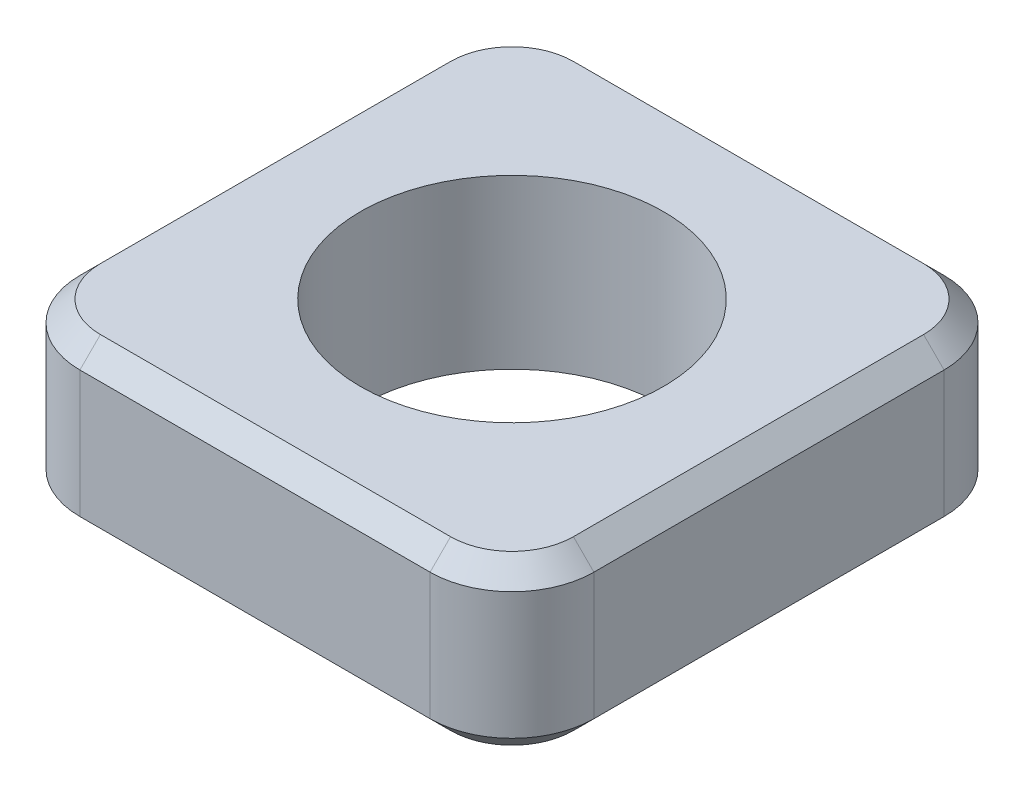
ISO-10303-21;
HEADER;
FILE_DESCRIPTION(('STEP AP214'),'2;1');
FILE_NAME('part.step','',(''),(''),'','','');
FILE_SCHEMA(('AUTOMOTIVE_DESIGN { 1 0 10303 214 1 1 1 1 }'));
ENDSEC;
DATA;
#1=APPLICATION_CONTEXT('core data for automotive mechanical design processes');
#2=APPLICATION_PROTOCOL_DEFINITION('international standard','automotive_design',2000,#1);
#3=PRODUCT_CONTEXT('',#1,'mechanical');
#4=PRODUCT('Part','Part','',(#3));
#5=PRODUCT_RELATED_PRODUCT_CATEGORY('part','',(#4));
#6=PRODUCT_DEFINITION_FORMATION('','',#4);
#7=PRODUCT_DEFINITION_CONTEXT('part definition',#1,'design');
#8=PRODUCT_DEFINITION('design','',#6,#7);
#9=PRODUCT_DEFINITION_SHAPE('','',#8);
#10=(LENGTH_UNIT() NAMED_UNIT(*) SI_UNIT(.MILLI.,.METRE.));
#11=(NAMED_UNIT(*) PLANE_ANGLE_UNIT() SI_UNIT($,.RADIAN.));
#12=(NAMED_UNIT(*) SI_UNIT($,.STERADIAN.) SOLID_ANGLE_UNIT());
#13=UNCERTAINTY_MEASURE_WITH_UNIT(LENGTH_MEASURE(1.E-05),#10,'distance_accuracy_value','');
#14=(GEOMETRIC_REPRESENTATION_CONTEXT(3) GLOBAL_UNCERTAINTY_ASSIGNED_CONTEXT((#13)) GLOBAL_UNIT_ASSIGNED_CONTEXT((#10,
#11,#12)) REPRESENTATION_CONTEXT('',''));
#15=CARTESIAN_POINT('',(0.,0.,0.));
#16=DIRECTION('',(0.,0.,1.));
#17=DIRECTION('',(1.,0.,0.));
#18=AXIS2_PLACEMENT_3D('',#15,#16,#17);
#19=CARTESIAN_POINT('',(2.1375,2.05,2.1375));
#20=DIRECTION('',(0.,1.,0.));
#21=DIRECTION('',(0.,0.,1.));
#22=AXIS2_PLACEMENT_3D('',#19,#20,#21);
#23=PLANE('',#22);
#24=CARTESIAN_POINT('',(2.1375,2.05,2.1375));
#25=DIRECTION('',(0.,1.,0.));
#26=DIRECTION('',(0.,0.,1.));
#27=AXIS2_PLACEMENT_3D('',#24,#25,#26);
#28=CIRCLE('',#27,0.749999999999999);
#29=CARTESIAN_POINT('',(2.1375,2.05,2.8875));
#30=VERTEX_POINT('',#29);
#31=CARTESIAN_POINT('',(2.8875,2.05,2.1375));
#32=VERTEX_POINT('',#31);
#33=EDGE_CURVE('E57',#30,#32,#28,.T.);
#34=ORIENTED_EDGE('',*,*,#33,.T.);
#35=DIRECTION('',(0.,0.,-1.));
#36=VECTOR('',#35,1.);
#37=CARTESIAN_POINT('',(2.8875,2.05,-2.1375));
#38=LINE('',#37,#36);
#39=CARTESIAN_POINT('',(2.8875,2.05,-2.1375));
#40=VERTEX_POINT('',#39);
#41=EDGE_CURVE('E11',#32,#40,#38,.T.);
#42=ORIENTED_EDGE('',*,*,#41,.T.);
#43=CARTESIAN_POINT('',(2.1375,2.05,-2.1375));
#44=DIRECTION('',(0.,1.,0.));
#45=DIRECTION('',(0.,0.,1.));
#46=AXIS2_PLACEMENT_3D('',#43,#44,#45);
#47=CIRCLE('',#46,0.75);
#48=CARTESIAN_POINT('',(2.1375,2.05,-2.8875));
#49=VERTEX_POINT('',#48);
#50=EDGE_CURVE('E42',#40,#49,#47,.T.);
#51=ORIENTED_EDGE('',*,*,#50,.T.);
#52=DIRECTION('',(-1.,0.,0.));
#53=VECTOR('',#52,1.);
#54=CARTESIAN_POINT('',(-2.1375,2.05,-2.8875));
#55=LINE('',#54,#53);
#56=CARTESIAN_POINT('',(-2.1375,2.05,-2.8875));
#57=VERTEX_POINT('',#56);
#58=EDGE_CURVE('E247',#49,#57,#55,.T.);
#59=ORIENTED_EDGE('',*,*,#58,.T.);
#60=CARTESIAN_POINT('',(-2.1375,2.05,-2.1375));
#61=DIRECTION('',(0.,1.,0.));
#62=DIRECTION('',(0.,0.,1.));
#63=AXIS2_PLACEMENT_3D('',#60,#61,#62);
#64=CIRCLE('',#63,0.75);
#65=CARTESIAN_POINT('',(-2.8875,2.05,-2.1375));
#66=VERTEX_POINT('',#65);
#67=EDGE_CURVE('E179',#57,#66,#64,.T.);
#68=ORIENTED_EDGE('',*,*,#67,.T.);
#69=DIRECTION('',(0.,0.,1.));
#70=VECTOR('',#69,1.);
#71=CARTESIAN_POINT('',(-2.8875,2.05,2.1375));
#72=LINE('',#71,#70);
#73=CARTESIAN_POINT('',(-2.8875,2.05,2.1375));
#74=VERTEX_POINT('',#73);
#75=EDGE_CURVE('E240',#66,#74,#72,.T.);
#76=ORIENTED_EDGE('',*,*,#75,.T.);
#77=CARTESIAN_POINT('',(-2.1375,2.05,2.1375));
#78=DIRECTION('',(0.,1.,0.));
#79=DIRECTION('',(0.,0.,1.));
#80=AXIS2_PLACEMENT_3D('',#77,#78,#79);
#81=CIRCLE('',#80,0.75);
#82=CARTESIAN_POINT('',(-2.1375,2.05,2.8875));
#83=VERTEX_POINT('',#82);
#84=EDGE_CURVE('E242',#74,#83,#81,.T.);
#85=ORIENTED_EDGE('',*,*,#84,.T.);
#86=DIRECTION('',(1.,0.,0.));
#87=VECTOR('',#86,1.);
#88=CARTESIAN_POINT('',(2.1375,2.05,2.8875));
#89=LINE('',#88,#87);
#90=EDGE_CURVE('E245',#83,#30,#89,.T.);
#91=ORIENTED_EDGE('',*,*,#90,.T.);
#92=EDGE_LOOP('',(#34,#42,#51,#59,#68,#76,#85,#91));
#93=FACE_BOUND('',#92,.T.);
#94=CARTESIAN_POINT('',(0.,2.05,0.));
#95=DIRECTION('',(0.,1.,0.));
#96=DIRECTION('',(0.,0.,1.));
#97=AXIS2_PLACEMENT_3D('',#94,#95,#96);
#98=CIRCLE('',#97,1.85);
#99=CARTESIAN_POINT('',(0.,2.05,1.85));
#100=VERTEX_POINT('',#99);
#101=EDGE_CURVE('E371',#100,#100,#98,.T.);
#102=ORIENTED_EDGE('',*,*,#101,.F.);
#103=EDGE_LOOP('',(#102));
#104=FACE_BOUND('',#103,.T.);
#105=ADVANCED_FACE('F33',(#93,#104),#23,.T.);
#106=CARTESIAN_POINT('',(2.1375,0.,2.1375));
#107=DIRECTION('',(0.,1.,0.));
#108=DIRECTION('',(0.,0.,1.));
#109=AXIS2_PLACEMENT_3D('',#106,#107,#108);
#110=PLANE('',#109);
#111=CARTESIAN_POINT('',(-2.1375,0.,-2.1375));
#112=DIRECTION('',(0.,1.,0.));
#113=DIRECTION('',(0.,0.,1.));
#114=AXIS2_PLACEMENT_3D('',#111,#112,#113);
#115=CIRCLE('',#114,0.749999999999998);
#116=CARTESIAN_POINT('',(-2.8875,0.,-2.1375));
#117=VERTEX_POINT('',#116);
#118=CARTESIAN_POINT('',(-2.1375,0.,-2.8875));
#119=VERTEX_POINT('',#118);
#120=EDGE_CURVE('E210',#117,#119,#115,.F.);
#121=ORIENTED_EDGE('',*,*,#120,.T.);
#122=DIRECTION('',(1.,0.,0.));
#123=VECTOR('',#122,1.);
#124=CARTESIAN_POINT('',(2.1375,0.,-2.8875));
#125=LINE('',#124,#123);
#126=CARTESIAN_POINT('',(2.1375,0.,-2.8875));
#127=VERTEX_POINT('',#126);
#128=EDGE_CURVE('E162',#119,#127,#125,.T.);
#129=ORIENTED_EDGE('',*,*,#128,.T.);
#130=CARTESIAN_POINT('',(2.1375,0.,-2.1375));
#131=DIRECTION('',(0.,1.,0.));
#132=DIRECTION('',(0.,0.,1.));
#133=AXIS2_PLACEMENT_3D('',#130,#131,#132);
#134=CIRCLE('',#133,0.749999999999998);
#135=CARTESIAN_POINT('',(2.8875,0.,-2.1375));
#136=VERTEX_POINT('',#135);
#137=EDGE_CURVE('E208',#127,#136,#134,.F.);
#138=ORIENTED_EDGE('',*,*,#137,.T.);
#139=DIRECTION('',(0.,0.,1.));
#140=VECTOR('',#139,1.);
#141=CARTESIAN_POINT('',(2.8875,0.,2.1375));
#142=LINE('',#141,#140);
#143=CARTESIAN_POINT('',(2.8875,0.,2.1375));
#144=VERTEX_POINT('',#143);
#145=EDGE_CURVE('E204',#136,#144,#142,.T.);
#146=ORIENTED_EDGE('',*,*,#145,.T.);
#147=CARTESIAN_POINT('',(2.1375,0.,2.1375));
#148=DIRECTION('',(0.,1.,0.));
#149=DIRECTION('',(0.,0.,1.));
#150=AXIS2_PLACEMENT_3D('',#147,#148,#149);
#151=CIRCLE('',#150,0.749999999999998);
#152=CARTESIAN_POINT('',(2.1375,0.,2.8875));
#153=VERTEX_POINT('',#152);
#154=EDGE_CURVE('E200',#144,#153,#151,.F.);
#155=ORIENTED_EDGE('',*,*,#154,.T.);
#156=DIRECTION('',(-1.,0.,0.));
#157=VECTOR('',#156,1.);
#158=CARTESIAN_POINT('',(2.1375,0.,2.8875));
#159=LINE('',#158,#157);
#160=CARTESIAN_POINT('',(-2.1375,0.,2.8875));
#161=VERTEX_POINT('',#160);
#162=EDGE_CURVE('E192',#153,#161,#159,.T.);
#163=ORIENTED_EDGE('',*,*,#162,.T.);
#164=CARTESIAN_POINT('',(-2.1375,0.,2.1375));
#165=DIRECTION('',(0.,1.,0.));
#166=DIRECTION('',(0.,0.,1.));
#167=AXIS2_PLACEMENT_3D('',#164,#165,#166);
#168=CIRCLE('',#167,0.749999999999999);
#169=CARTESIAN_POINT('',(-2.8875,0.,2.1375));
#170=VERTEX_POINT('',#169);
#171=EDGE_CURVE('E202',#161,#170,#168,.F.);
#172=ORIENTED_EDGE('',*,*,#171,.T.);
#173=DIRECTION('',(0.,0.,-1.));
#174=VECTOR('',#173,1.);
#175=CARTESIAN_POINT('',(-2.8875,0.,2.1375));
#176=LINE('',#175,#174);
#177=EDGE_CURVE('E206',#170,#117,#176,.T.);
#178=ORIENTED_EDGE('',*,*,#177,.T.);
#179=EDGE_LOOP('',(#121,#129,#138,#146,#155,#163,#172,#178));
#180=FACE_BOUND('',#179,.T.);
#181=CARTESIAN_POINT('',(0.,0.,0.));
#182=DIRECTION('',(0.,1.,0.));
#183=DIRECTION('',(0.,0.,1.));
#184=AXIS2_PLACEMENT_3D('',#181,#182,#183);
#185=CIRCLE('',#184,1.85);
#186=CARTESIAN_POINT('',(0.,0.,1.85));
#187=VERTEX_POINT('',#186);
#188=EDGE_CURVE('E273',#187,#187,#185,.T.);
#189=ORIENTED_EDGE('',*,*,#188,.T.);
#190=EDGE_LOOP('',(#189));
#191=FACE_BOUND('',#190,.T.);
#192=ADVANCED_FACE('F367',(#180,#191),#110,.F.);
#193=CARTESIAN_POINT('',(2.1375,2.05,2.1375));
#194=DIRECTION('',(0.,-1.,0.));
#195=DIRECTION('',(0.,0.,-1.));
#196=AXIS2_PLACEMENT_3D('',#193,#194,#195);
#197=CYLINDRICAL_SURFACE('',#196,1.);
#198=DIRECTION('',(0.,-1.,0.));
#199=VECTOR('',#198,1.);
#200=CARTESIAN_POINT('',(2.1375,2.05,3.1375));
#201=LINE('',#200,#199);
#202=CARTESIAN_POINT('',(2.1375,1.8,3.1375));
#203=VERTEX_POINT('',#202);
#204=CARTESIAN_POINT('',(2.1375,0.250000000000001,3.1375));
#205=VERTEX_POINT('',#204);
#206=EDGE_CURVE('E304',#203,#205,#201,.T.);
#207=ORIENTED_EDGE('',*,*,#206,.T.);
#208=CARTESIAN_POINT('',(2.1375,0.250000000000001,2.1375));
#209=DIRECTION('',(0.,1.,0.));
#210=DIRECTION('',(0.,0.,1.));
#211=AXIS2_PLACEMENT_3D('',#208,#209,#210);
#212=CIRCLE('',#211,1.);
#213=CARTESIAN_POINT('',(3.1375,0.250000000000001,2.1375));
#214=VERTEX_POINT('',#213);
#215=EDGE_CURVE('E234',#205,#214,#212,.T.);
#216=ORIENTED_EDGE('',*,*,#215,.T.);
#217=DIRECTION('',(0.,-1.,0.));
#218=VECTOR('',#217,1.);
#219=CARTESIAN_POINT('',(3.1375,2.05,2.1375));
#220=LINE('',#219,#218);
#221=CARTESIAN_POINT('',(3.1375,1.8,2.1375));
#222=VERTEX_POINT('',#221);
#223=EDGE_CURVE('E190',#222,#214,#220,.T.);
#224=ORIENTED_EDGE('',*,*,#223,.F.);
#225=CARTESIAN_POINT('',(2.1375,1.8,2.1375));
#226=DIRECTION('',(0.,1.,0.));
#227=DIRECTION('',(0.,0.,1.));
#228=AXIS2_PLACEMENT_3D('',#225,#226,#227);
#229=CIRCLE('',#228,1.);
#230=EDGE_CURVE('E232',#222,#203,#229,.F.);
#231=ORIENTED_EDGE('',*,*,#230,.T.);
#232=EDGE_LOOP('',(#207,#216,#224,#231));
#233=FACE_BOUND('',#232,.T.);
#234=ADVANCED_FACE('F359',(#233),#197,.T.);
#235=CARTESIAN_POINT('',(3.1375,2.05,-2.1375));
#236=DIRECTION('',(-1.,0.,0.));
#237=DIRECTION('',(0.,0.,1.));
#238=AXIS2_PLACEMENT_3D('',#235,#236,#237);
#239=PLANE('',#238);
#240=ORIENTED_EDGE('',*,*,#223,.T.);
#241=DIRECTION('',(0.,0.,-1.));
#242=VECTOR('',#241,1.);
#243=CARTESIAN_POINT('',(3.1375,0.250000000000001,-2.1375));
#244=LINE('',#243,#242);
#245=CARTESIAN_POINT('',(3.1375,0.250000000000001,-2.1375));
#246=VERTEX_POINT('',#245);
#247=EDGE_CURVE('E226',#214,#246,#244,.T.);
#248=ORIENTED_EDGE('',*,*,#247,.T.);
#249=DIRECTION('',(0.,-1.,0.));
#250=VECTOR('',#249,1.);
#251=CARTESIAN_POINT('',(3.1375,2.05,-2.1375));
#252=LINE('',#251,#250);
#253=CARTESIAN_POINT('',(3.1375,1.8,-2.1375));
#254=VERTEX_POINT('',#253);
#255=EDGE_CURVE('E195',#254,#246,#252,.T.);
#256=ORIENTED_EDGE('',*,*,#255,.F.);
#257=DIRECTION('',(0.,0.,1.));
#258=VECTOR('',#257,1.);
#259=CARTESIAN_POINT('',(3.1375,1.8,2.1375));
#260=LINE('',#259,#258);
#261=EDGE_CURVE('E223',#254,#222,#260,.T.);
#262=ORIENTED_EDGE('',*,*,#261,.T.);
#263=EDGE_LOOP('',(#240,#248,#256,#262));
#264=FACE_BOUND('',#263,.T.);
#265=ADVANCED_FACE('F360',(#264),#239,.F.);
#266=CARTESIAN_POINT('',(2.1375,2.05,-2.1375));
#267=DIRECTION('',(0.,-1.,0.));
#268=DIRECTION('',(0.,0.,-1.));
#269=AXIS2_PLACEMENT_3D('',#266,#267,#268);
#270=CYLINDRICAL_SURFACE('',#269,1.);
#271=ORIENTED_EDGE('',*,*,#255,.T.);
#272=CARTESIAN_POINT('',(2.1375,0.250000000000001,-2.1375));
#273=DIRECTION('',(0.,1.,0.));
#274=DIRECTION('',(0.,0.,1.));
#275=AXIS2_PLACEMENT_3D('',#272,#273,#274);
#276=CIRCLE('',#275,1.);
#277=CARTESIAN_POINT('',(2.1375,0.250000000000001,-3.1375));
#278=VERTEX_POINT('',#277);
#279=EDGE_CURVE('E217',#246,#278,#276,.T.);
#280=ORIENTED_EDGE('',*,*,#279,.T.);
#281=DIRECTION('',(0.,-1.,0.));
#282=VECTOR('',#281,1.);
#283=CARTESIAN_POINT('',(2.1375,2.05,-3.1375));
#284=LINE('',#283,#282);
#285=CARTESIAN_POINT('',(2.1375,1.8,-3.1375));
#286=VERTEX_POINT('',#285);
#287=EDGE_CURVE('E173',#286,#278,#284,.T.);
#288=ORIENTED_EDGE('',*,*,#287,.F.);
#289=CARTESIAN_POINT('',(2.1375,1.8,-2.1375));
#290=DIRECTION('',(0.,1.,0.));
#291=DIRECTION('',(0.,0.,1.));
#292=AXIS2_PLACEMENT_3D('',#289,#290,#291);
#293=CIRCLE('',#292,1.);
#294=EDGE_CURVE('E215',#286,#254,#293,.F.);
#295=ORIENTED_EDGE('',*,*,#294,.T.);
#296=EDGE_LOOP('',(#271,#280,#288,#295));
#297=FACE_BOUND('',#296,.T.);
#298=ADVANCED_FACE('F312',(#297),#270,.T.);
#299=CARTESIAN_POINT('',(-2.1375,2.05,-3.1375));
#300=DIRECTION('',(0.,0.,1.));
#301=DIRECTION('',(1.,0.,0.));
#302=AXIS2_PLACEMENT_3D('',#299,#300,#301);
#303=PLANE('',#302);
#304=ORIENTED_EDGE('',*,*,#287,.T.);
#305=DIRECTION('',(-1.,0.,0.));
#306=VECTOR('',#305,1.);
#307=CARTESIAN_POINT('',(-2.1375,0.250000000000001,-3.1375));
#308=LINE('',#307,#306);
#309=CARTESIAN_POINT('',(-2.1375,0.250000000000001,-3.1375));
#310=VERTEX_POINT('',#309);
#311=EDGE_CURVE('E172',#278,#310,#308,.T.);
#312=ORIENTED_EDGE('',*,*,#311,.T.);
#313=DIRECTION('',(0.,-1.,0.));
#314=VECTOR('',#313,1.);
#315=CARTESIAN_POINT('',(-2.1375,2.05,-3.1375));
#316=LINE('',#315,#314);
#317=CARTESIAN_POINT('',(-2.1375,1.8,-3.1375));
#318=VERTEX_POINT('',#317);
#319=EDGE_CURVE('E154',#318,#310,#316,.T.);
#320=ORIENTED_EDGE('',*,*,#319,.F.);
#321=DIRECTION('',(1.,0.,0.));
#322=VECTOR('',#321,1.);
#323=CARTESIAN_POINT('',(2.1375,1.8,-3.1375));
#324=LINE('',#323,#322);
#325=EDGE_CURVE('E169',#318,#286,#324,.T.);
#326=ORIENTED_EDGE('',*,*,#325,.T.);
#327=EDGE_LOOP('',(#304,#312,#320,#326));
#328=FACE_BOUND('',#327,.T.);
#329=ADVANCED_FACE('F167',(#328),#303,.F.);
#330=CARTESIAN_POINT('',(-2.1375,2.05,-2.1375));
#331=DIRECTION('',(0.,-1.,0.));
#332=DIRECTION('',(0.,0.,-1.));
#333=AXIS2_PLACEMENT_3D('',#330,#331,#332);
#334=CYLINDRICAL_SURFACE('',#333,1.);
#335=ORIENTED_EDGE('',*,*,#319,.T.);
#336=CARTESIAN_POINT('',(-2.1375,0.250000000000001,-2.1375));
#337=DIRECTION('',(0.,1.,0.));
#338=DIRECTION('',(0.,0.,1.));
#339=AXIS2_PLACEMENT_3D('',#336,#337,#338);
#340=CIRCLE('',#339,1.);
#341=CARTESIAN_POINT('',(-3.1375,0.250000000000001,-2.1375));
#342=VERTEX_POINT('',#341);
#343=EDGE_CURVE('E161',#310,#342,#340,.T.);
#344=ORIENTED_EDGE('',*,*,#343,.T.);
#345=DIRECTION('',(0.,-1.,0.));
#346=VECTOR('',#345,1.);
#347=CARTESIAN_POINT('',(-3.1375,2.05,-2.1375));
#348=LINE('',#347,#346);
#349=CARTESIAN_POINT('',(-3.1375,1.8,-2.1375));
#350=VERTEX_POINT('',#349);
#351=EDGE_CURVE('E156',#350,#342,#348,.T.);
#352=ORIENTED_EDGE('',*,*,#351,.F.);
#353=CARTESIAN_POINT('',(-2.1375,1.8,-2.1375));
#354=DIRECTION('',(0.,1.,0.));
#355=DIRECTION('',(0.,0.,1.));
#356=AXIS2_PLACEMENT_3D('',#353,#354,#355);
#357=CIRCLE('',#356,1.);
#358=EDGE_CURVE('E151',#350,#318,#357,.F.);
#359=ORIENTED_EDGE('',*,*,#358,.T.);
#360=EDGE_LOOP('',(#335,#344,#352,#359));
#361=FACE_BOUND('',#360,.T.);
#362=ADVANCED_FACE('F153',(#361),#334,.T.);
#363=CARTESIAN_POINT('',(-3.1375,2.05,-2.1375));
#364=DIRECTION('',(1.,0.,0.));
#365=DIRECTION('',(0.,0.,-1.));
#366=AXIS2_PLACEMENT_3D('',#363,#364,#365);
#367=PLANE('',#366);
#368=ORIENTED_EDGE('',*,*,#351,.T.);
#369=DIRECTION('',(0.,0.,1.));
#370=VECTOR('',#369,1.);
#371=CARTESIAN_POINT('',(-3.1375,0.250000000000001,-2.1375));
#372=LINE('',#371,#370);
#373=CARTESIAN_POINT('',(-3.1375,0.250000000000001,2.1375));
#374=VERTEX_POINT('',#373);
#375=EDGE_CURVE('E221',#342,#374,#372,.T.);
#376=ORIENTED_EDGE('',*,*,#375,.T.);
#377=DIRECTION('',(0.,-1.,0.));
#378=VECTOR('',#377,1.);
#379=CARTESIAN_POINT('',(-3.1375,2.05,2.1375));
#380=LINE('',#379,#378);
#381=CARTESIAN_POINT('',(-3.1375,1.8,2.1375));
#382=VERTEX_POINT('',#381);
#383=EDGE_CURVE('E297',#382,#374,#380,.T.);
#384=ORIENTED_EDGE('',*,*,#383,.F.);
#385=DIRECTION('',(0.,0.,-1.));
#386=VECTOR('',#385,1.);
#387=CARTESIAN_POINT('',(-3.1375,1.8,-2.1375));
#388=LINE('',#387,#386);
#389=EDGE_CURVE('E219',#382,#350,#388,.T.);
#390=ORIENTED_EDGE('',*,*,#389,.T.);
#391=EDGE_LOOP('',(#368,#376,#384,#390));
#392=FACE_BOUND('',#391,.T.);
#393=ADVANCED_FACE('F294',(#392),#367,.F.);
#394=CARTESIAN_POINT('',(-2.1375,2.05,2.1375));
#395=DIRECTION('',(0.,-1.,0.));
#396=DIRECTION('',(0.,0.,-1.));
#397=AXIS2_PLACEMENT_3D('',#394,#395,#396);
#398=CYLINDRICAL_SURFACE('',#397,1.);
#399=ORIENTED_EDGE('',*,*,#383,.T.);
#400=CARTESIAN_POINT('',(-2.1375,0.250000000000001,2.1375));
#401=DIRECTION('',(0.,1.,0.));
#402=DIRECTION('',(0.,0.,1.));
#403=AXIS2_PLACEMENT_3D('',#400,#401,#402);
#404=CIRCLE('',#403,1.);
#405=CARTESIAN_POINT('',(-2.1375,0.250000000000001,3.1375));
#406=VERTEX_POINT('',#405);
#407=EDGE_CURVE('E230',#374,#406,#404,.T.);
#408=ORIENTED_EDGE('',*,*,#407,.T.);
#409=DIRECTION('',(0.,-1.,0.));
#410=VECTOR('',#409,1.);
#411=CARTESIAN_POINT('',(-2.1375,2.05,3.1375));
#412=LINE('',#411,#410);
#413=CARTESIAN_POINT('',(-2.1375,1.8,3.1375));
#414=VERTEX_POINT('',#413);
#415=EDGE_CURVE('E300',#414,#406,#412,.T.);
#416=ORIENTED_EDGE('',*,*,#415,.F.);
#417=CARTESIAN_POINT('',(-2.1375,1.8,2.1375));
#418=DIRECTION('',(0.,1.,0.));
#419=DIRECTION('',(0.,0.,1.));
#420=AXIS2_PLACEMENT_3D('',#417,#418,#419);
#421=CIRCLE('',#420,1.);
#422=EDGE_CURVE('E228',#414,#382,#421,.F.);
#423=ORIENTED_EDGE('',*,*,#422,.T.);
#424=EDGE_LOOP('',(#399,#408,#416,#423));
#425=FACE_BOUND('',#424,.T.);
#426=ADVANCED_FACE('F341',(#425),#398,.T.);
#427=CARTESIAN_POINT('',(-2.1375,2.05,3.1375));
#428=DIRECTION('',(0.,0.,-1.));
#429=DIRECTION('',(-1.,0.,0.));
#430=AXIS2_PLACEMENT_3D('',#427,#428,#429);
#431=PLANE('',#430);
#432=ORIENTED_EDGE('',*,*,#415,.T.);
#433=DIRECTION('',(1.,0.,0.));
#434=VECTOR('',#433,1.);
#435=CARTESIAN_POINT('',(-2.1375,0.250000000000001,3.1375));
#436=LINE('',#435,#434);
#437=EDGE_CURVE('E238',#406,#205,#436,.T.);
#438=ORIENTED_EDGE('',*,*,#437,.T.);
#439=ORIENTED_EDGE('',*,*,#206,.F.);
#440=DIRECTION('',(-1.,0.,0.));
#441=VECTOR('',#440,1.);
#442=CARTESIAN_POINT('',(-2.1375,1.8,3.1375));
#443=LINE('',#442,#441);
#444=EDGE_CURVE('E236',#203,#414,#443,.T.);
#445=ORIENTED_EDGE('',*,*,#444,.T.);
#446=EDGE_LOOP('',(#432,#438,#439,#445));
#447=FACE_BOUND('',#446,.T.);
#448=ADVANCED_FACE('F344',(#447),#431,.F.);
#449=CARTESIAN_POINT('',(0.,2.05,0.));
#450=DIRECTION('',(0.,-1.,0.));
#451=DIRECTION('',(0.,0.,-1.));
#452=AXIS2_PLACEMENT_3D('',#449,#450,#451);
#453=CYLINDRICAL_SURFACE('',#452,1.85);
#454=ORIENTED_EDGE('',*,*,#101,.T.);
#455=EDGE_LOOP('',(#454));
#456=FACE_BOUND('',#455,.T.);
#457=ORIENTED_EDGE('',*,*,#188,.F.);
#458=EDGE_LOOP('',(#457));
#459=FACE_BOUND('',#458,.T.);
#460=ADVANCED_FACE('F379',(#456,#459),#453,.F.);
#461=CARTESIAN_POINT('',(-2.1375,0.250000000000001,3.1375));
#462=DIRECTION('',(0.,0.707106781186549,-0.707106781186546));
#463=DIRECTION('',(1.,0.,0.));
#464=AXIS2_PLACEMENT_3D('',#461,#462,#463);
#465=PLANE('',#464);
#466=DIRECTION('',(0.,0.707106781186546,0.707106781186549));
#467=VECTOR('',#466,1.);
#468=CARTESIAN_POINT('',(-2.1375,0.,2.8875));
#469=LINE('',#468,#467);
#470=EDGE_CURVE('E267',#161,#406,#469,.T.);
#471=ORIENTED_EDGE('',*,*,#470,.F.);
#472=ORIENTED_EDGE('',*,*,#162,.F.);
#473=DIRECTION('',(0.,-0.707106781186546,-0.707106781186549));
#474=VECTOR('',#473,1.);
#475=CARTESIAN_POINT('',(2.1375,0.250000000000001,3.1375));
#476=LINE('',#475,#474);
#477=EDGE_CURVE('E270',#205,#153,#476,.T.);
#478=ORIENTED_EDGE('',*,*,#477,.F.);
#479=ORIENTED_EDGE('',*,*,#437,.F.);
#480=EDGE_LOOP('',(#471,#472,#478,#479));
#481=FACE_BOUND('',#480,.T.);
#482=ADVANCED_FACE('F350',(#481),#465,.F.);
#483=CARTESIAN_POINT('',(2.1375,0.250000000000001,2.1375));
#484=DIRECTION('',(0.,1.,0.));
#485=DIRECTION('',(0.,0.,1.));
#486=AXIS2_PLACEMENT_3D('',#483,#484,#485);
#487=CONICAL_SURFACE('',#486,1.,0.78539816339745);
#488=ORIENTED_EDGE('',*,*,#477,.T.);
#489=ORIENTED_EDGE('',*,*,#154,.F.);
#490=DIRECTION('',(-0.707106781186548,-0.707106781186547,0.));
#491=VECTOR('',#490,1.);
#492=CARTESIAN_POINT('',(3.1375,0.250000000000001,2.1375));
#493=LINE('',#492,#491);
#494=EDGE_CURVE('E264',#214,#144,#493,.T.);
#495=ORIENTED_EDGE('',*,*,#494,.F.);
#496=ORIENTED_EDGE('',*,*,#215,.F.);
#497=EDGE_LOOP('',(#488,#489,#495,#496));
#498=FACE_BOUND('',#497,.T.);
#499=ADVANCED_FACE('F356',(#498),#487,.T.);
#500=CARTESIAN_POINT('',(-2.1375,0.250000000000001,2.1375));
#501=DIRECTION('',(0.,1.,0.));
#502=DIRECTION('',(0.,0.,1.));
#503=AXIS2_PLACEMENT_3D('',#500,#501,#502);
#504=CONICAL_SURFACE('',#503,1.,0.78539816339745);
#505=ORIENTED_EDGE('',*,*,#470,.T.);
#506=ORIENTED_EDGE('',*,*,#407,.F.);
#507=DIRECTION('',(-0.707106781186549,0.707106781186546,0.));
#508=VECTOR('',#507,1.);
#509=CARTESIAN_POINT('',(-2.8875,0.,2.1375));
#510=LINE('',#509,#508);
#511=EDGE_CURVE('E261',#170,#374,#510,.T.);
#512=ORIENTED_EDGE('',*,*,#511,.F.);
#513=ORIENTED_EDGE('',*,*,#171,.F.);
#514=EDGE_LOOP('',(#505,#506,#512,#513));
#515=FACE_BOUND('',#514,.T.);
#516=ADVANCED_FACE('F338',(#515),#504,.T.);
#517=CARTESIAN_POINT('',(3.1375,0.250000000000001,-2.1375));
#518=DIRECTION('',(-0.707106781186546,0.707106781186549,0.));
#519=DIRECTION('',(0.,0.,-1.));
#520=AXIS2_PLACEMENT_3D('',#517,#518,#519);
#521=PLANE('',#520);
#522=ORIENTED_EDGE('',*,*,#494,.T.);
#523=ORIENTED_EDGE('',*,*,#145,.F.);
#524=DIRECTION('',(-0.707106781186549,-0.707106781186546,0.));
#525=VECTOR('',#524,1.);
#526=CARTESIAN_POINT('',(3.1375,0.250000000000001,-2.1375));
#527=LINE('',#526,#525);
#528=EDGE_CURVE('E258',#246,#136,#527,.T.);
#529=ORIENTED_EDGE('',*,*,#528,.F.);
#530=ORIENTED_EDGE('',*,*,#247,.F.);
#531=EDGE_LOOP('',(#522,#523,#529,#530));
#532=FACE_BOUND('',#531,.T.);
#533=ADVANCED_FACE('F318',(#532),#521,.F.);
#534=CARTESIAN_POINT('',(-3.1375,0.250000000000001,-2.1375));
#535=DIRECTION('',(0.707106781186547,0.707106781186548,0.));
#536=DIRECTION('',(0.,0.,1.));
#537=AXIS2_PLACEMENT_3D('',#534,#535,#536);
#538=PLANE('',#537);
#539=ORIENTED_EDGE('',*,*,#511,.T.);
#540=ORIENTED_EDGE('',*,*,#375,.F.);
#541=DIRECTION('',(-0.707106781186548,0.707106781186547,0.));
#542=VECTOR('',#541,1.);
#543=CARTESIAN_POINT('',(-2.8875,0.,-2.1375));
#544=LINE('',#543,#542);
#545=EDGE_CURVE('E255',#117,#342,#544,.T.);
#546=ORIENTED_EDGE('',*,*,#545,.F.);
#547=ORIENTED_EDGE('',*,*,#177,.F.);
#548=EDGE_LOOP('',(#539,#540,#546,#547));
#549=FACE_BOUND('',#548,.T.);
#550=ADVANCED_FACE('F334',(#549),#538,.F.);
#551=CARTESIAN_POINT('',(2.1375,0.250000000000001,-2.1375));
#552=DIRECTION('',(0.,1.,0.));
#553=DIRECTION('',(0.,0.,1.));
#554=AXIS2_PLACEMENT_3D('',#551,#552,#553);
#555=CONICAL_SURFACE('',#554,1.,0.78539816339745);
#556=ORIENTED_EDGE('',*,*,#528,.T.);
#557=ORIENTED_EDGE('',*,*,#137,.F.);
#558=DIRECTION('',(0.,-0.707106781186546,0.707106781186549));
#559=VECTOR('',#558,1.);
#560=CARTESIAN_POINT('',(2.1375,0.250000000000001,-3.1375));
#561=LINE('',#560,#559);
#562=EDGE_CURVE('E253',#278,#127,#561,.T.);
#563=ORIENTED_EDGE('',*,*,#562,.F.);
#564=ORIENTED_EDGE('',*,*,#279,.F.);
#565=EDGE_LOOP('',(#556,#557,#563,#564));
#566=FACE_BOUND('',#565,.T.);
#567=ADVANCED_FACE('F322',(#566),#555,.T.);
#568=CARTESIAN_POINT('',(-2.1375,0.250000000000001,-2.1375));
#569=DIRECTION('',(0.,1.,0.));
#570=DIRECTION('',(0.,0.,1.));
#571=AXIS2_PLACEMENT_3D('',#568,#569,#570);
#572=CONICAL_SURFACE('',#571,1.,0.78539816339745);
#573=ORIENTED_EDGE('',*,*,#545,.T.);
#574=ORIENTED_EDGE('',*,*,#343,.F.);
#575=DIRECTION('',(0.,0.707106781186546,-0.707106781186549));
#576=VECTOR('',#575,1.);
#577=CARTESIAN_POINT('',(-2.1375,0.,-2.8875));
#578=LINE('',#577,#576);
#579=EDGE_CURVE('E251',#119,#310,#578,.T.);
#580=ORIENTED_EDGE('',*,*,#579,.F.);
#581=ORIENTED_EDGE('',*,*,#120,.F.);
#582=EDGE_LOOP('',(#573,#574,#580,#581));
#583=FACE_BOUND('',#582,.T.);
#584=ADVANCED_FACE('F330',(#583),#572,.T.);
#585=CARTESIAN_POINT('',(-2.1375,0.250000000000001,-3.1375));
#586=DIRECTION('',(0.,0.707106781186548,0.707106781186547));
#587=DIRECTION('',(-1.,0.,0.));
#588=AXIS2_PLACEMENT_3D('',#585,#586,#587);
#589=PLANE('',#588);
#590=ORIENTED_EDGE('',*,*,#562,.T.);
#591=ORIENTED_EDGE('',*,*,#128,.F.);
#592=ORIENTED_EDGE('',*,*,#579,.T.);
#593=ORIENTED_EDGE('',*,*,#311,.F.);
#594=EDGE_LOOP('',(#590,#591,#592,#593));
#595=FACE_BOUND('',#594,.T.);
#596=ADVANCED_FACE('F325',(#595),#589,.F.);
#597=CARTESIAN_POINT('',(-2.8875,2.05,2.1375));
#598=DIRECTION('',(-0.707106781186548,0.707106781186547,0.));
#599=DIRECTION('',(0.,0.,-1.));
#600=AXIS2_PLACEMENT_3D('',#597,#598,#599);
#601=PLANE('',#600);
#602=DIRECTION('',(0.707106781186547,0.707106781186548,0.));
#603=VECTOR('',#602,1.);
#604=CARTESIAN_POINT('',(-3.1375,1.8,-2.1375));
#605=LINE('',#604,#603);
#606=EDGE_CURVE('E281',#350,#66,#605,.T.);
#607=ORIENTED_EDGE('',*,*,#606,.F.);
#608=ORIENTED_EDGE('',*,*,#389,.F.);
#609=DIRECTION('',(-0.707106781186547,-0.707106781186548,0.));
#610=VECTOR('',#609,1.);
#611=CARTESIAN_POINT('',(-2.8875,2.05,2.1375));
#612=LINE('',#611,#610);
#613=EDGE_CURVE('E37',#74,#382,#612,.T.);
#614=ORIENTED_EDGE('',*,*,#613,.F.);
#615=ORIENTED_EDGE('',*,*,#75,.F.);
#616=EDGE_LOOP('',(#607,#608,#614,#615));
#617=FACE_BOUND('',#616,.T.);
#618=ADVANCED_FACE('F35',(#617),#601,.T.);
#619=CARTESIAN_POINT('',(-2.1375,2.05,2.1375));
#620=DIRECTION('',(0.,-1.,0.));
#621=DIRECTION('',(0.,0.,-1.));
#622=AXIS2_PLACEMENT_3D('',#619,#620,#621);
#623=CONICAL_SURFACE('',#622,0.75,0.785398163397449);
#624=ORIENTED_EDGE('',*,*,#613,.T.);
#625=ORIENTED_EDGE('',*,*,#422,.F.);
#626=DIRECTION('',(0.,-0.707106781186547,0.707106781186547));
#627=VECTOR('',#626,1.);
#628=CARTESIAN_POINT('',(-2.1375,2.05,2.8875));
#629=LINE('',#628,#627);
#630=EDGE_CURVE('E182',#83,#414,#629,.T.);
#631=ORIENTED_EDGE('',*,*,#630,.F.);
#632=ORIENTED_EDGE('',*,*,#84,.F.);
#633=EDGE_LOOP('',(#624,#625,#631,#632));
#634=FACE_BOUND('',#633,.T.);
#635=ADVANCED_FACE('F287',(#634),#623,.T.);
#636=CARTESIAN_POINT('',(-2.1375,2.05,-2.1375));
#637=DIRECTION('',(0.,-1.,0.));
#638=DIRECTION('',(0.,0.,-1.));
#639=AXIS2_PLACEMENT_3D('',#636,#637,#638);
#640=CONICAL_SURFACE('',#639,0.75,0.785398163397448);
#641=ORIENTED_EDGE('',*,*,#606,.T.);
#642=ORIENTED_EDGE('',*,*,#67,.F.);
#643=DIRECTION('',(0.,0.707106781186547,0.707106781186547));
#644=VECTOR('',#643,1.);
#645=CARTESIAN_POINT('',(-2.1375,1.8,-3.1375));
#646=LINE('',#645,#644);
#647=EDGE_CURVE('E177',#318,#57,#646,.T.);
#648=ORIENTED_EDGE('',*,*,#647,.F.);
#649=ORIENTED_EDGE('',*,*,#358,.F.);
#650=EDGE_LOOP('',(#641,#642,#648,#649));
#651=FACE_BOUND('',#650,.T.);
#652=ADVANCED_FACE('F178',(#651),#640,.T.);
#653=CARTESIAN_POINT('',(2.1375,2.05,2.8875));
#654=DIRECTION('',(0.,0.707106781186547,0.707106781186547));
#655=DIRECTION('',(-1.,0.,0.));
#656=AXIS2_PLACEMENT_3D('',#653,#654,#655);
#657=PLANE('',#656);
#658=ORIENTED_EDGE('',*,*,#630,.T.);
#659=ORIENTED_EDGE('',*,*,#444,.F.);
#660=DIRECTION('',(0.,-0.707106781186547,0.707106781186547));
#661=VECTOR('',#660,1.);
#662=CARTESIAN_POINT('',(2.1375,2.05,2.8875));
#663=LINE('',#662,#661);
#664=EDGE_CURVE('E183',#30,#203,#663,.T.);
#665=ORIENTED_EDGE('',*,*,#664,.F.);
#666=ORIENTED_EDGE('',*,*,#90,.F.);
#667=EDGE_LOOP('',(#658,#659,#665,#666));
#668=FACE_BOUND('',#667,.T.);
#669=ADVANCED_FACE('F430',(#668),#657,.T.);
#670=CARTESIAN_POINT('',(2.1375,2.05,-2.8875));
#671=DIRECTION('',(0.,0.707106781186547,-0.707106781186548));
#672=DIRECTION('',(1.,0.,0.));
#673=AXIS2_PLACEMENT_3D('',#670,#671,#672);
#674=PLANE('',#673);
#675=ORIENTED_EDGE('',*,*,#647,.T.);
#676=ORIENTED_EDGE('',*,*,#58,.F.);
#677=DIRECTION('',(0.,0.707106781186548,0.707106781186547));
#678=VECTOR('',#677,1.);
#679=CARTESIAN_POINT('',(2.1375,1.8,-3.1375));
#680=LINE('',#679,#678);
#681=EDGE_CURVE('E188',#286,#49,#680,.T.);
#682=ORIENTED_EDGE('',*,*,#681,.F.);
#683=ORIENTED_EDGE('',*,*,#325,.F.);
#684=EDGE_LOOP('',(#675,#676,#682,#683));
#685=FACE_BOUND('',#684,.T.);
#686=ADVANCED_FACE('F186',(#685),#674,.T.);
#687=CARTESIAN_POINT('',(2.1375,2.05,2.1375));
#688=DIRECTION('',(0.,-1.,0.));
#689=DIRECTION('',(0.,0.,-1.));
#690=AXIS2_PLACEMENT_3D('',#687,#688,#689);
#691=CONICAL_SURFACE('',#690,0.749999999999999,0.785398163397449);
#692=ORIENTED_EDGE('',*,*,#664,.T.);
#693=ORIENTED_EDGE('',*,*,#230,.F.);
#694=DIRECTION('',(0.707106781186547,-0.707106781186547,0.));
#695=VECTOR('',#694,1.);
#696=CARTESIAN_POINT('',(2.8875,2.05,2.1375));
#697=LINE('',#696,#695);
#698=EDGE_CURVE('E275',#32,#222,#697,.T.);
#699=ORIENTED_EDGE('',*,*,#698,.F.);
#700=ORIENTED_EDGE('',*,*,#33,.F.);
#701=EDGE_LOOP('',(#692,#693,#699,#700));
#702=FACE_BOUND('',#701,.T.);
#703=ADVANCED_FACE('F424',(#702),#691,.T.);
#704=CARTESIAN_POINT('',(2.1375,2.05,-2.1375));
#705=DIRECTION('',(0.,-1.,0.));
#706=DIRECTION('',(0.,0.,-1.));
#707=AXIS2_PLACEMENT_3D('',#704,#705,#706);
#708=CONICAL_SURFACE('',#707,0.75,0.785398163397448);
#709=ORIENTED_EDGE('',*,*,#681,.T.);
#710=ORIENTED_EDGE('',*,*,#50,.F.);
#711=DIRECTION('',(-0.707106781186547,0.707106781186547,0.));
#712=VECTOR('',#711,1.);
#713=CARTESIAN_POINT('',(3.1375,1.8,-2.1375));
#714=LINE('',#713,#712);
#715=EDGE_CURVE('E50',#254,#40,#714,.T.);
#716=ORIENTED_EDGE('',*,*,#715,.F.);
#717=ORIENTED_EDGE('',*,*,#294,.F.);
#718=EDGE_LOOP('',(#709,#710,#716,#717));
#719=FACE_BOUND('',#718,.T.);
#720=ADVANCED_FACE('F364',(#719),#708,.T.);
#721=CARTESIAN_POINT('',(2.8875,2.05,2.1375));
#722=DIRECTION('',(0.707106781186547,0.707106781186547,0.));
#723=DIRECTION('',(0.,0.,1.));
#724=AXIS2_PLACEMENT_3D('',#721,#722,#723);
#725=PLANE('',#724);
#726=ORIENTED_EDGE('',*,*,#698,.T.);
#727=ORIENTED_EDGE('',*,*,#261,.F.);
#728=ORIENTED_EDGE('',*,*,#715,.T.);
#729=ORIENTED_EDGE('',*,*,#41,.F.);
#730=EDGE_LOOP('',(#726,#727,#728,#729));
#731=FACE_BOUND('',#730,.T.);
#732=ADVANCED_FACE('F361',(#731),#725,.T.);
#733=CLOSED_SHELL('',(#105,#192,#234,#265,#298,#329,#362,#393,#426,#448,#460,#482,#499,#516,
#533,#550,#567,#584,#596,#618,#635,#652,#669,#686,#703,#720,#732));
#734=MANIFOLD_SOLID_BREP('B2',#733);
#735=ADVANCED_BREP_SHAPE_REPRESENTATION('',(#18,#734),#14);
#736=SHAPE_DEFINITION_REPRESENTATION(#9,#735);
ENDSEC;
END-ISO-10303-21;
